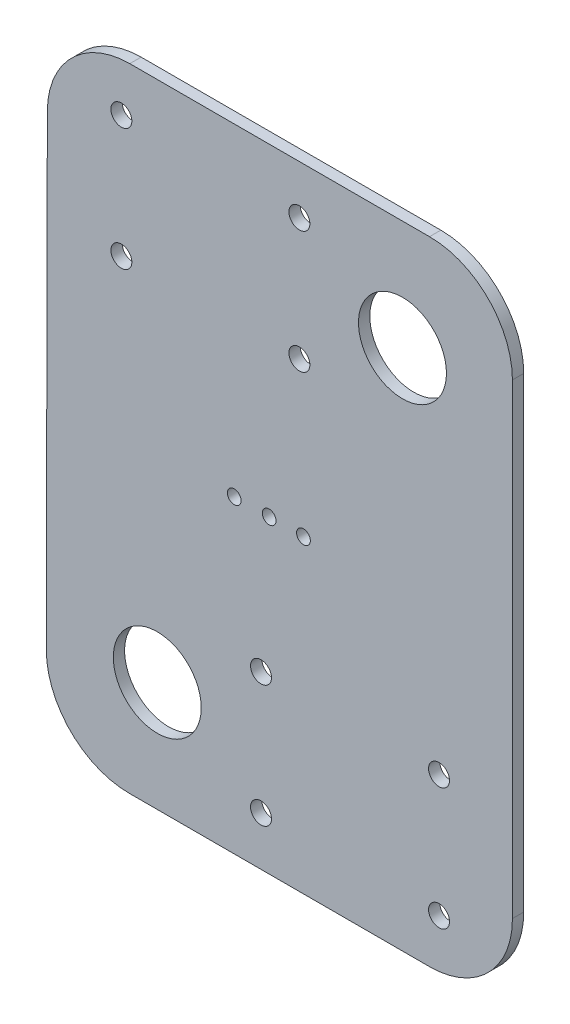
ISO-10303-21;
HEADER;
FILE_DESCRIPTION(('STEP AP214'),'2;1');
FILE_NAME('part.step','',(''),(''),'','','');
FILE_SCHEMA(('AUTOMOTIVE_DESIGN { 1 0 10303 214 1 1 1 1 }'));
ENDSEC;
DATA;
#1=APPLICATION_CONTEXT('core data for automotive mechanical design processes');
#2=APPLICATION_PROTOCOL_DEFINITION('international standard','automotive_design',2000,#1);
#3=PRODUCT_CONTEXT('',#1,'mechanical');
#4=PRODUCT('Part','Part','',(#3));
#5=PRODUCT_RELATED_PRODUCT_CATEGORY('part','',(#4));
#6=PRODUCT_DEFINITION_FORMATION('','',#4);
#7=PRODUCT_DEFINITION_CONTEXT('part definition',#1,'design');
#8=PRODUCT_DEFINITION('design','',#6,#7);
#9=PRODUCT_DEFINITION_SHAPE('','',#8);
#10=(LENGTH_UNIT() NAMED_UNIT(*) SI_UNIT(.MILLI.,.METRE.));
#11=(NAMED_UNIT(*) PLANE_ANGLE_UNIT() SI_UNIT($,.RADIAN.));
#12=(NAMED_UNIT(*) SI_UNIT($,.STERADIAN.) SOLID_ANGLE_UNIT());
#13=UNCERTAINTY_MEASURE_WITH_UNIT(LENGTH_MEASURE(1.E-05),#10,'distance_accuracy_value','');
#14=(GEOMETRIC_REPRESENTATION_CONTEXT(3) GLOBAL_UNCERTAINTY_ASSIGNED_CONTEXT((#13)) GLOBAL_UNIT_ASSIGNED_CONTEXT((#10,
#11,#12)) REPRESENTATION_CONTEXT('',''));
#15=CARTESIAN_POINT('',(0.,0.,0.));
#16=DIRECTION('',(0.,0.,1.));
#17=DIRECTION('',(1.,0.,0.));
#18=AXIS2_PLACEMENT_3D('',#15,#16,#17);
#19=CARTESIAN_POINT('',(69.322869268775,27.047872515798,-0.41148));
#20=DIRECTION('',(0.,0.,-1.));
#21=DIRECTION('',(-0.999978348347153,-0.00658048910793101,0.));
#22=AXIS2_PLACEMENT_3D('',#19,#20,#21);
#23=CYLINDRICAL_SURFACE('',#22,3.019933251512);
#24=CARTESIAN_POINT('',(69.322869268775,27.047872515798,-0.41148));
#25=DIRECTION('',(0.,0.,1.));
#26=DIRECTION('',(-0.999978348347153,-0.00658048910793101,0.));
#27=AXIS2_PLACEMENT_3D('',#24,#25,#26);
#28=CIRCLE('',#27,3.019933251512);
#29=CARTESIAN_POINT('',(66.303001403809,27.02799987793,-0.41148));
#30=VERTEX_POINT('',#29);
#31=CARTESIAN_POINT('',(69.342002868652,24.02799987793,-0.41148));
#32=VERTEX_POINT('',#31);
#33=EDGE_CURVE('E48',#30,#32,#28,.T.);
#34=ORIENTED_EDGE('',*,*,#33,.T.);
#35=DIRECTION('',(0.,0.,1.));
#36=VECTOR('',#35,1.);
#37=CARTESIAN_POINT('',(69.342002868652,24.02799987793,-0.41148));
#38=LINE('',#37,#36);
#39=CARTESIAN_POINT('',(69.342002868652,24.02799987793,0.));
#40=VERTEX_POINT('',#39);
#41=EDGE_CURVE('E221',#32,#40,#38,.T.);
#42=ORIENTED_EDGE('',*,*,#41,.T.);
#43=CARTESIAN_POINT('',(69.322869268775,27.047872515798,0.));
#44=DIRECTION('',(0.,0.,1.));
#45=DIRECTION('',(-0.999978348347153,-0.00658048910793101,0.));
#46=AXIS2_PLACEMENT_3D('',#43,#44,#45);
#47=CIRCLE('',#46,3.019933251512);
#48=CARTESIAN_POINT('',(66.303001403809,27.02799987793,0.));
#49=VERTEX_POINT('',#48);
#50=EDGE_CURVE('E262',#49,#40,#47,.T.);
#51=ORIENTED_EDGE('',*,*,#50,.F.);
#52=DIRECTION('',(0.,0.,1.));
#53=VECTOR('',#52,1.);
#54=CARTESIAN_POINT('',(66.303001403809,27.02799987793,-0.41148));
#55=LINE('',#54,#53);
#56=EDGE_CURVE('E11',#30,#49,#55,.T.);
#57=ORIENTED_EDGE('',*,*,#56,.F.);
#58=EDGE_LOOP('',(#34,#42,#51,#57));
#59=FACE_BOUND('',#58,.T.);
#60=ADVANCED_FACE('F38',(#59),#23,.T.);
#61=CARTESIAN_POINT('',(69.342002868652,24.02799987793,-0.41148));
#62=DIRECTION('',(0.,1.,0.));
#63=DIRECTION('',(1.,0.,0.));
#64=AXIS2_PLACEMENT_3D('',#61,#62,#63);
#65=PLANE('',#64);
#66=DIRECTION('',(1.,0.,0.));
#67=VECTOR('',#66,1.);
#68=CARTESIAN_POINT('',(69.342002868652,24.02799987793,-0.41148));
#69=LINE('',#68,#67);
#70=CARTESIAN_POINT('',(80.262001037598,24.02799987793,-0.41148));
#71=VERTEX_POINT('',#70);
#72=EDGE_CURVE('E218',#32,#71,#69,.T.);
#73=ORIENTED_EDGE('',*,*,#72,.T.);
#74=DIRECTION('',(0.,0.,1.));
#75=VECTOR('',#74,1.);
#76=CARTESIAN_POINT('',(80.262001037598,24.02799987793,-0.41148));
#77=LINE('',#76,#75);
#78=CARTESIAN_POINT('',(80.262001037598,24.02799987793,0.));
#79=VERTEX_POINT('',#78);
#80=EDGE_CURVE('E222',#71,#79,#77,.T.);
#81=ORIENTED_EDGE('',*,*,#80,.T.);
#82=DIRECTION('',(1.,0.,0.));
#83=VECTOR('',#82,1.);
#84=CARTESIAN_POINT('',(69.342002868652,24.02799987793,0.));
#85=LINE('',#84,#83);
#86=EDGE_CURVE('E266',#40,#79,#85,.T.);
#87=ORIENTED_EDGE('',*,*,#86,.F.);
#88=ORIENTED_EDGE('',*,*,#41,.F.);
#89=EDGE_LOOP('',(#73,#81,#87,#88));
#90=FACE_BOUND('',#89,.T.);
#91=ADVANCED_FACE('F40',(#90),#65,.F.);
#92=CARTESIAN_POINT('',(80.250663672675,27.039338483001,-0.41148));
#93=DIRECTION('',(0.,0.,-1.));
#94=DIRECTION('',(0.00376486541703731,-0.999992912869082,0.));
#95=AXIS2_PLACEMENT_3D('',#92,#93,#94);
#96=CYLINDRICAL_SURFACE('',#95,3.011359946974);
#97=CARTESIAN_POINT('',(80.250663672675,27.039338483001,-0.41148));
#98=DIRECTION('',(0.,0.,1.));
#99=DIRECTION('',(0.00376486541703731,-0.999992912869082,0.));
#100=AXIS2_PLACEMENT_3D('',#97,#98,#99);
#101=CIRCLE('',#100,3.011359946974);
#102=CARTESIAN_POINT('',(83.262001037598,27.051000595093,-0.41148));
#103=VERTEX_POINT('',#102);
#104=EDGE_CURVE('E307',#71,#103,#101,.T.);
#105=ORIENTED_EDGE('',*,*,#104,.T.);
#106=DIRECTION('',(0.,0.,1.));
#107=VECTOR('',#106,1.);
#108=CARTESIAN_POINT('',(83.262001037598,27.051000595093,-0.41148));
#109=LINE('',#108,#107);
#110=CARTESIAN_POINT('',(83.262001037598,27.051000595093,0.));
#111=VERTEX_POINT('',#110);
#112=EDGE_CURVE('E318',#103,#111,#109,.T.);
#113=ORIENTED_EDGE('',*,*,#112,.T.);
#114=CARTESIAN_POINT('',(80.250663672675,27.039338483001,0.));
#115=DIRECTION('',(0.,0.,1.));
#116=DIRECTION('',(0.00376486541703731,-0.999992912869082,0.));
#117=AXIS2_PLACEMENT_3D('',#114,#115,#116);
#118=CIRCLE('',#117,3.011359946974);
#119=EDGE_CURVE('E322',#79,#111,#118,.T.);
#120=ORIENTED_EDGE('',*,*,#119,.F.);
#121=ORIENTED_EDGE('',*,*,#80,.F.);
#122=EDGE_LOOP('',(#105,#113,#120,#121));
#123=FACE_BOUND('',#122,.T.);
#124=ADVANCED_FACE('F382',(#123),#96,.T.);
#125=CARTESIAN_POINT('',(83.262001037598,27.051000595093,-0.41148));
#126=DIRECTION('',(-1.,0.,0.));
#127=DIRECTION('',(0.,0.,1.));
#128=AXIS2_PLACEMENT_3D('',#125,#126,#127);
#129=PLANE('',#128);
#130=DIRECTION('',(0.,1.,0.));
#131=VECTOR('',#130,1.);
#132=CARTESIAN_POINT('',(83.262001037598,27.051000595093,-0.41148));
#133=LINE('',#132,#131);
#134=CARTESIAN_POINT('',(83.262001037598,44.021999359131,-0.41148));
#135=VERTEX_POINT('',#134);
#136=EDGE_CURVE('E234',#103,#135,#133,.T.);
#137=ORIENTED_EDGE('',*,*,#136,.T.);
#138=DIRECTION('',(0.,0.,1.));
#139=VECTOR('',#138,1.);
#140=CARTESIAN_POINT('',(83.262001037598,44.021999359131,-0.41148));
#141=LINE('',#140,#139);
#142=CARTESIAN_POINT('',(83.262001037598,44.021999359131,0.));
#143=VERTEX_POINT('',#142);
#144=EDGE_CURVE('E231',#135,#143,#141,.T.);
#145=ORIENTED_EDGE('',*,*,#144,.T.);
#146=DIRECTION('',(0.,1.,0.));
#147=VECTOR('',#146,1.);
#148=CARTESIAN_POINT('',(83.262001037598,27.051000595093,0.));
#149=LINE('',#148,#147);
#150=EDGE_CURVE('E173',#111,#143,#149,.T.);
#151=ORIENTED_EDGE('',*,*,#150,.F.);
#152=ORIENTED_EDGE('',*,*,#112,.F.);
#153=EDGE_LOOP('',(#137,#145,#151,#152));
#154=FACE_BOUND('',#153,.T.);
#155=ADVANCED_FACE('F390',(#154),#129,.F.);
#156=CARTESIAN_POINT('',(80.250668110381,44.016665842291,-0.41148));
#157=DIRECTION('',(0.,0.,-1.));
#158=DIRECTION('',(0.999998431520749,0.00177114540403055,0.));
#159=AXIS2_PLACEMENT_3D('',#156,#157,#158);
#160=CYLINDRICAL_SURFACE('',#159,3.011337650437);
#161=CARTESIAN_POINT('',(80.250668110381,44.016665842291,-0.41148));
#162=DIRECTION('',(0.,0.,1.));
#163=DIRECTION('',(0.999998431520749,0.00177114540403055,0.));
#164=AXIS2_PLACEMENT_3D('',#161,#162,#163);
#165=CIRCLE('',#164,3.011337650437);
#166=CARTESIAN_POINT('',(80.246002197266,47.02799987793,-0.41148));
#167=VERTEX_POINT('',#166);
#168=EDGE_CURVE('E235',#135,#167,#165,.T.);
#169=ORIENTED_EDGE('',*,*,#168,.T.);
#170=DIRECTION('',(0.,0.,1.));
#171=VECTOR('',#170,1.);
#172=CARTESIAN_POINT('',(80.246002197266,47.02799987793,-0.41148));
#173=LINE('',#172,#171);
#174=CARTESIAN_POINT('',(80.246002197266,47.02799987793,0.));
#175=VERTEX_POINT('',#174);
#176=EDGE_CURVE('E241',#167,#175,#173,.T.);
#177=ORIENTED_EDGE('',*,*,#176,.T.);
#178=CARTESIAN_POINT('',(80.250668110381,44.016665842291,0.));
#179=DIRECTION('',(0.,0.,1.));
#180=DIRECTION('',(0.999998431520749,0.00177114540403055,0.));
#181=AXIS2_PLACEMENT_3D('',#178,#179,#180);
#182=CIRCLE('',#181,3.011337650437);
#183=EDGE_CURVE('E170',#143,#175,#182,.T.);
#184=ORIENTED_EDGE('',*,*,#183,.F.);
#185=ORIENTED_EDGE('',*,*,#144,.F.);
#186=EDGE_LOOP('',(#169,#177,#184,#185));
#187=FACE_BOUND('',#186,.T.);
#188=ADVANCED_FACE('F405',(#187),#160,.T.);
#189=CARTESIAN_POINT('',(80.246002197266,47.02799987793,-0.41148));
#190=DIRECTION('',(0.,-1.,0.));
#191=DIRECTION('',(0.,0.,-1.));
#192=AXIS2_PLACEMENT_3D('',#189,#190,#191);
#193=PLANE('',#192);
#194=DIRECTION('',(-1.,0.,0.));
#195=VECTOR('',#194,1.);
#196=CARTESIAN_POINT('',(80.246002197266,47.02799987793,-0.41148));
#197=LINE('',#196,#195);
#198=CARTESIAN_POINT('',(69.342002868652,47.02799987793,-0.41148));
#199=VERTEX_POINT('',#198);
#200=EDGE_CURVE('E209',#167,#199,#197,.T.);
#201=ORIENTED_EDGE('',*,*,#200,.T.);
#202=DIRECTION('',(0.,0.,1.));
#203=VECTOR('',#202,1.);
#204=CARTESIAN_POINT('',(69.342002868652,47.02799987793,-0.41148));
#205=LINE('',#204,#203);
#206=CARTESIAN_POINT('',(69.342002868652,47.02799987793,0.));
#207=VERTEX_POINT('',#206);
#208=EDGE_CURVE('E207',#199,#207,#205,.T.);
#209=ORIENTED_EDGE('',*,*,#208,.T.);
#210=DIRECTION('',(-1.,0.,0.));
#211=VECTOR('',#210,1.);
#212=CARTESIAN_POINT('',(80.246002197266,47.02799987793,0.));
#213=LINE('',#212,#211);
#214=EDGE_CURVE('E167',#175,#207,#213,.T.);
#215=ORIENTED_EDGE('',*,*,#214,.F.);
#216=ORIENTED_EDGE('',*,*,#176,.F.);
#217=EDGE_LOOP('',(#201,#209,#215,#216));
#218=FACE_BOUND('',#217,.T.);
#219=ADVANCED_FACE('F409',(#218),#193,.F.);
#220=CARTESIAN_POINT('',(69.351632143134,44.01836062726,-0.41148));
#221=DIRECTION('',(0.,0.,-1.));
#222=DIRECTION('',(-0.0031994615945799,0.999994881709654,0.));
#223=AXIS2_PLACEMENT_3D('',#220,#221,#222);
#224=CYLINDRICAL_SURFACE('',#223,3.009654654956);
#225=DIRECTION('',(0.,0.,-1.));
#226=VECTOR('',#225,1.);
#227=CARTESIAN_POINT('',(66.342002868652,44.0307207356427,-0.41148));
#228=LINE('',#227,#226);
#229=CARTESIAN_POINT('',(66.342002868652,44.0307207356427,0.));
#230=VERTEX_POINT('',#229);
#231=CARTESIAN_POINT('',(66.342002868652,44.0307207356427,-0.41148));
#232=VERTEX_POINT('',#231);
#233=EDGE_CURVE('E148',#230,#232,#228,.T.);
#234=ORIENTED_EDGE('',*,*,#233,.F.);
#235=CARTESIAN_POINT('',(69.351632143134,44.01836062726,0.));
#236=DIRECTION('',(0.,0.,1.));
#237=DIRECTION('',(-0.0031994615945799,0.999994881709654,0.));
#238=AXIS2_PLACEMENT_3D('',#235,#236,#237);
#239=CIRCLE('',#238,3.009654654956);
#240=EDGE_CURVE('E154',#207,#230,#239,.T.);
#241=ORIENTED_EDGE('',*,*,#240,.F.);
#242=ORIENTED_EDGE('',*,*,#208,.F.);
#243=CARTESIAN_POINT('',(69.351632143134,44.01836062726,-0.41148));
#244=DIRECTION('',(0.,0.,1.));
#245=DIRECTION('',(-0.0031994615945799,0.999994881709654,0.));
#246=AXIS2_PLACEMENT_3D('',#243,#244,#245);
#247=CIRCLE('',#246,3.009654654956);
#248=EDGE_CURVE('E161',#199,#232,#247,.T.);
#249=ORIENTED_EDGE('',*,*,#248,.T.);
#250=EDGE_LOOP('',(#234,#241,#242,#249));
#251=FACE_BOUND('',#250,.T.);
#252=ADVANCED_FACE('F158',(#251),#224,.T.);
#253=CARTESIAN_POINT('',(74.11565314,25.80836342,-0.41148));
#254=DIRECTION('',(0.,0.,-1.));
#255=DIRECTION('',(1.,0.,0.));
#256=AXIS2_PLACEMENT_3D('',#253,#254,#255);
#257=CYLINDRICAL_SURFACE('',#256,0.381);
#258=DIRECTION('',(0.,0.,1.));
#259=VECTOR('',#258,1.);
#260=CARTESIAN_POINT('',(74.49665314,25.80836342,-0.41148));
#261=LINE('',#260,#259);
#262=CARTESIAN_POINT('',(74.49665314,25.80836342,-0.41148));
#263=VERTEX_POINT('',#262);
#264=CARTESIAN_POINT('',(74.49665314,25.80836342,0.));
#265=VERTEX_POINT('',#264);
#266=EDGE_CURVE('E192',#263,#265,#261,.T.);
#267=ORIENTED_EDGE('',*,*,#266,.T.);
#268=CARTESIAN_POINT('',(74.11565314,25.80836342,0.));
#269=DIRECTION('',(0.,0.,1.));
#270=DIRECTION('',(1.,0.,0.));
#271=AXIS2_PLACEMENT_3D('',#268,#269,#270);
#272=CIRCLE('',#271,0.381);
#273=EDGE_CURVE('E195',#265,#265,#272,.T.);
#274=ORIENTED_EDGE('',*,*,#273,.T.);
#275=ORIENTED_EDGE('',*,*,#266,.F.);
#276=CARTESIAN_POINT('',(74.11565314,25.80836342,-0.41148));
#277=DIRECTION('',(0.,0.,1.));
#278=DIRECTION('',(1.,0.,0.));
#279=AXIS2_PLACEMENT_3D('',#276,#277,#278);
#280=CIRCLE('',#279,0.381);
#281=EDGE_CURVE('E214',#263,#263,#280,.T.);
#282=ORIENTED_EDGE('',*,*,#281,.F.);
#283=EDGE_LOOP('',(#267,#274,#275,#282));
#284=FACE_BOUND('',#283,.T.);
#285=ADVANCED_FACE('F392',(#284),#257,.F.);
#286=CARTESIAN_POINT('',(70.3416551,28.02836406,-0.41148));
#287=DIRECTION('',(0.,0.,-1.));
#288=DIRECTION('',(1.,0.,0.));
#289=AXIS2_PLACEMENT_3D('',#286,#287,#288);
#290=CYLINDRICAL_SURFACE('',#289,1.59999934);
#291=DIRECTION('',(0.,0.,1.));
#292=VECTOR('',#291,1.);
#293=CARTESIAN_POINT('',(71.94165444,28.02836406,-0.41148));
#294=LINE('',#293,#292);
#295=CARTESIAN_POINT('',(71.94165444,28.02836406,-0.41148));
#296=VERTEX_POINT('',#295);
#297=CARTESIAN_POINT('',(71.94165444,28.02836406,0.));
#298=VERTEX_POINT('',#297);
#299=EDGE_CURVE('E244',#296,#298,#294,.T.);
#300=ORIENTED_EDGE('',*,*,#299,.T.);
#301=CARTESIAN_POINT('',(70.3416551,28.02836406,0.));
#302=DIRECTION('',(0.,0.,1.));
#303=DIRECTION('',(1.,0.,0.));
#304=AXIS2_PLACEMENT_3D('',#301,#302,#303);
#305=CIRCLE('',#304,1.59999934);
#306=EDGE_CURVE('E259',#298,#298,#305,.T.);
#307=ORIENTED_EDGE('',*,*,#306,.T.);
#308=ORIENTED_EDGE('',*,*,#299,.F.);
#309=CARTESIAN_POINT('',(70.3416551,28.02836406,-0.41148));
#310=DIRECTION('',(0.,0.,1.));
#311=DIRECTION('',(1.,0.,0.));
#312=AXIS2_PLACEMENT_3D('',#309,#310,#311);
#313=CIRCLE('',#312,1.59999934);
#314=EDGE_CURVE('E215',#296,#296,#313,.T.);
#315=ORIENTED_EDGE('',*,*,#314,.F.);
#316=EDGE_LOOP('',(#300,#307,#308,#315));
#317=FACE_BOUND('',#316,.T.);
#318=ADVANCED_FACE('F395',(#317),#290,.F.);
#319=CARTESIAN_POINT('',(80.59265314,25.80836342,-0.41148));
#320=DIRECTION('',(0.,0.,-1.));
#321=DIRECTION('',(1.,0.,0.));
#322=AXIS2_PLACEMENT_3D('',#319,#320,#321);
#323=CYLINDRICAL_SURFACE('',#322,0.381);
#324=DIRECTION('',(0.,0.,1.));
#325=VECTOR('',#324,1.);
#326=CARTESIAN_POINT('',(80.97365314,25.80836342,-0.41148));
#327=LINE('',#326,#325);
#328=CARTESIAN_POINT('',(80.97365314,25.80836342,-0.41148));
#329=VERTEX_POINT('',#328);
#330=CARTESIAN_POINT('',(80.97365314,25.80836342,0.));
#331=VERTEX_POINT('',#330);
#332=EDGE_CURVE('E278',#329,#331,#327,.T.);
#333=ORIENTED_EDGE('',*,*,#332,.T.);
#334=CARTESIAN_POINT('',(80.59265314,25.80836342,0.));
#335=DIRECTION('',(0.,0.,1.));
#336=DIRECTION('',(1.,0.,0.));
#337=AXIS2_PLACEMENT_3D('',#334,#335,#336);
#338=CIRCLE('',#337,0.381);
#339=EDGE_CURVE('E281',#331,#331,#338,.T.);
#340=ORIENTED_EDGE('',*,*,#339,.T.);
#341=ORIENTED_EDGE('',*,*,#332,.F.);
#342=CARTESIAN_POINT('',(80.59265314,25.80836342,-0.41148));
#343=DIRECTION('',(0.,0.,1.));
#344=DIRECTION('',(1.,0.,0.));
#345=AXIS2_PLACEMENT_3D('',#342,#343,#344);
#346=CIRCLE('',#345,0.381);
#347=EDGE_CURVE('E185',#329,#329,#346,.T.);
#348=ORIENTED_EDGE('',*,*,#347,.F.);
#349=EDGE_LOOP('',(#333,#340,#341,#348));
#350=FACE_BOUND('',#349,.T.);
#351=ADVANCED_FACE('F497',(#350),#323,.F.);
#352=CARTESIAN_POINT('',(73.14025504,35.28136454,-0.41148));
#353=DIRECTION('',(0.,0.,-1.));
#354=DIRECTION('',(1.,0.,0.));
#355=AXIS2_PLACEMENT_3D('',#352,#353,#354);
#356=CYLINDRICAL_SURFACE('',#355,0.2499995);
#357=DIRECTION('',(0.,0.,1.));
#358=VECTOR('',#357,1.);
#359=CARTESIAN_POINT('',(73.39025454,35.28136454,-0.41148));
#360=LINE('',#359,#358);
#361=CARTESIAN_POINT('',(73.39025454,35.28136454,-0.41148));
#362=VERTEX_POINT('',#361);
#363=CARTESIAN_POINT('',(73.39025454,35.28136454,0.));
#364=VERTEX_POINT('',#363);
#365=EDGE_CURVE('E285',#362,#364,#360,.T.);
#366=ORIENTED_EDGE('',*,*,#365,.T.);
#367=CARTESIAN_POINT('',(73.14025504,35.28136454,0.));
#368=DIRECTION('',(0.,0.,1.));
#369=DIRECTION('',(1.,0.,0.));
#370=AXIS2_PLACEMENT_3D('',#367,#368,#369);
#371=CIRCLE('',#370,0.2499995);
#372=EDGE_CURVE('E288',#364,#364,#371,.T.);
#373=ORIENTED_EDGE('',*,*,#372,.T.);
#374=ORIENTED_EDGE('',*,*,#365,.F.);
#375=CARTESIAN_POINT('',(73.14025504,35.28136454,-0.41148));
#376=DIRECTION('',(0.,0.,1.));
#377=DIRECTION('',(1.,0.,0.));
#378=AXIS2_PLACEMENT_3D('',#375,#376,#377);
#379=CIRCLE('',#378,0.2499995);
#380=EDGE_CURVE('E182',#362,#362,#379,.T.);
#381=ORIENTED_EDGE('',*,*,#380,.F.);
#382=EDGE_LOOP('',(#366,#373,#374,#381));
#383=FACE_BOUND('',#382,.T.);
#384=ADVANCED_FACE('F489',(#383),#356,.F.);
#385=CARTESIAN_POINT('',(80.59265314,30.25336342,-0.41148));
#386=DIRECTION('',(0.,0.,-1.));
#387=DIRECTION('',(1.,0.,0.));
#388=AXIS2_PLACEMENT_3D('',#385,#386,#387);
#389=CYLINDRICAL_SURFACE('',#388,0.381);
#390=DIRECTION('',(0.,0.,1.));
#391=VECTOR('',#390,1.);
#392=CARTESIAN_POINT('',(80.97365314,30.25336342,-0.41148));
#393=LINE('',#392,#391);
#394=CARTESIAN_POINT('',(80.97365314,30.25336342,-0.41148));
#395=VERTEX_POINT('',#394);
#396=CARTESIAN_POINT('',(80.97365314,30.25336342,0.));
#397=VERTEX_POINT('',#396);
#398=EDGE_CURVE('E293',#395,#397,#393,.T.);
#399=ORIENTED_EDGE('',*,*,#398,.T.);
#400=CARTESIAN_POINT('',(80.59265314,30.25336342,0.));
#401=DIRECTION('',(0.,0.,1.));
#402=DIRECTION('',(1.,0.,0.));
#403=AXIS2_PLACEMENT_3D('',#400,#401,#402);
#404=CIRCLE('',#403,0.381);
#405=EDGE_CURVE('E303',#397,#397,#404,.T.);
#406=ORIENTED_EDGE('',*,*,#405,.T.);
#407=ORIENTED_EDGE('',*,*,#398,.F.);
#408=CARTESIAN_POINT('',(80.59265314,30.25336342,-0.41148));
#409=DIRECTION('',(0.,0.,1.));
#410=DIRECTION('',(1.,0.,0.));
#411=AXIS2_PLACEMENT_3D('',#408,#409,#410);
#412=CIRCLE('',#411,0.381);
#413=EDGE_CURVE('E186',#395,#395,#412,.T.);
#414=ORIENTED_EDGE('',*,*,#413,.F.);
#415=EDGE_LOOP('',(#399,#406,#407,#414));
#416=FACE_BOUND('',#415,.T.);
#417=ADVANCED_FACE('F342',(#416),#389,.F.);
#418=CARTESIAN_POINT('',(74.11565314,30.25336342,-0.41148));
#419=DIRECTION('',(0.,0.,-1.));
#420=DIRECTION('',(1.,0.,0.));
#421=AXIS2_PLACEMENT_3D('',#418,#419,#420);
#422=CYLINDRICAL_SURFACE('',#421,0.381);
#423=DIRECTION('',(0.,0.,1.));
#424=VECTOR('',#423,1.);
#425=CARTESIAN_POINT('',(74.49665314,30.25336342,-0.41148));
#426=LINE('',#425,#424);
#427=CARTESIAN_POINT('',(74.49665314,30.25336342,-0.41148));
#428=VERTEX_POINT('',#427);
#429=CARTESIAN_POINT('',(74.49665314,30.25336342,0.));
#430=VERTEX_POINT('',#429);
#431=EDGE_CURVE('E272',#428,#430,#426,.T.);
#432=ORIENTED_EDGE('',*,*,#431,.T.);
#433=CARTESIAN_POINT('',(74.11565314,30.25336342,0.));
#434=DIRECTION('',(0.,0.,1.));
#435=DIRECTION('',(1.,0.,0.));
#436=AXIS2_PLACEMENT_3D('',#433,#434,#435);
#437=CIRCLE('',#436,0.381);
#438=EDGE_CURVE('E205',#430,#430,#437,.T.);
#439=ORIENTED_EDGE('',*,*,#438,.T.);
#440=ORIENTED_EDGE('',*,*,#431,.F.);
#441=CARTESIAN_POINT('',(74.11565314,30.25336342,-0.41148));
#442=DIRECTION('',(0.,0.,1.));
#443=DIRECTION('',(1.,0.,0.));
#444=AXIS2_PLACEMENT_3D('',#441,#442,#443);
#445=CIRCLE('',#444,0.381);
#446=EDGE_CURVE('E230',#428,#428,#445,.T.);
#447=ORIENTED_EDGE('',*,*,#446,.F.);
#448=EDGE_LOOP('',(#432,#439,#440,#447));
#449=FACE_BOUND('',#448,.T.);
#450=ADVANCED_FACE('F475',(#449),#422,.F.);
#451=CARTESIAN_POINT('',(69.03525436,40.80856456,-0.41148));
#452=DIRECTION('',(0.,0.,-1.));
#453=DIRECTION('',(1.,0.,0.));
#454=AXIS2_PLACEMENT_3D('',#451,#452,#453);
#455=CYLINDRICAL_SURFACE('',#454,0.381);
#456=DIRECTION('',(0.,0.,1.));
#457=VECTOR('',#456,1.);
#458=CARTESIAN_POINT('',(69.41625436,40.80856456,-0.41148));
#459=LINE('',#458,#457);
#460=CARTESIAN_POINT('',(69.41625436,40.80856456,-0.41148));
#461=VERTEX_POINT('',#460);
#462=CARTESIAN_POINT('',(69.41625436,40.80856456,0.));
#463=VERTEX_POINT('',#462);
#464=EDGE_CURVE('E202',#461,#463,#459,.T.);
#465=ORIENTED_EDGE('',*,*,#464,.T.);
#466=CARTESIAN_POINT('',(69.03525436,40.80856456,0.));
#467=DIRECTION('',(0.,0.,1.));
#468=DIRECTION('',(1.,0.,0.));
#469=AXIS2_PLACEMENT_3D('',#466,#467,#468);
#470=CIRCLE('',#469,0.381);
#471=EDGE_CURVE('E206',#463,#463,#470,.T.);
#472=ORIENTED_EDGE('',*,*,#471,.T.);
#473=ORIENTED_EDGE('',*,*,#464,.F.);
#474=CARTESIAN_POINT('',(69.03525436,40.80856456,-0.41148));
#475=DIRECTION('',(0.,0.,1.));
#476=DIRECTION('',(1.,0.,0.));
#477=AXIS2_PLACEMENT_3D('',#474,#475,#476);
#478=CIRCLE('',#477,0.381);
#479=EDGE_CURVE('E267',#461,#461,#478,.T.);
#480=ORIENTED_EDGE('',*,*,#479,.F.);
#481=EDGE_LOOP('',(#465,#472,#473,#480));
#482=FACE_BOUND('',#481,.T.);
#483=ADVANCED_FACE('F401',(#482),#455,.F.);
#484=CARTESIAN_POINT('',(74.41025504,35.28136454,-0.41148));
#485=DIRECTION('',(0.,0.,-1.));
#486=DIRECTION('',(1.,0.,0.));
#487=AXIS2_PLACEMENT_3D('',#484,#485,#486);
#488=CYLINDRICAL_SURFACE('',#487,0.2499995);
#489=DIRECTION('',(0.,0.,1.));
#490=VECTOR('',#489,1.);
#491=CARTESIAN_POINT('',(74.66025454,35.28136454,-0.41148));
#492=LINE('',#491,#490);
#493=CARTESIAN_POINT('',(74.66025454,35.28136454,-0.41148));
#494=VERTEX_POINT('',#493);
#495=CARTESIAN_POINT('',(74.66025454,35.28136454,0.));
#496=VERTEX_POINT('',#495);
#497=EDGE_CURVE('E254',#494,#496,#492,.T.);
#498=ORIENTED_EDGE('',*,*,#497,.T.);
#499=CARTESIAN_POINT('',(74.41025504,35.28136454,0.));
#500=DIRECTION('',(0.,0.,1.));
#501=DIRECTION('',(1.,0.,0.));
#502=AXIS2_PLACEMENT_3D('',#499,#500,#501);
#503=CIRCLE('',#502,0.2499995);
#504=EDGE_CURVE('E189',#496,#496,#503,.T.);
#505=ORIENTED_EDGE('',*,*,#504,.T.);
#506=ORIENTED_EDGE('',*,*,#497,.F.);
#507=CARTESIAN_POINT('',(74.41025504,35.28136454,-0.41148));
#508=DIRECTION('',(0.,0.,1.));
#509=DIRECTION('',(1.,0.,0.));
#510=AXIS2_PLACEMENT_3D('',#507,#508,#509);
#511=CIRCLE('',#510,0.2499995);
#512=EDGE_CURVE('E226',#494,#494,#511,.T.);
#513=ORIENTED_EDGE('',*,*,#512,.F.);
#514=EDGE_LOOP('',(#498,#505,#506,#513));
#515=FACE_BOUND('',#514,.T.);
#516=ADVANCED_FACE('F397',(#515),#488,.F.);
#517=CARTESIAN_POINT('',(75.66025508,35.28136454,-0.41148));
#518=DIRECTION('',(0.,0.,-1.));
#519=DIRECTION('',(1.,0.,0.));
#520=AXIS2_PLACEMENT_3D('',#517,#518,#519);
#521=CYLINDRICAL_SURFACE('',#520,0.2499995);
#522=DIRECTION('',(0.,0.,1.));
#523=VECTOR('',#522,1.);
#524=CARTESIAN_POINT('',(75.91025458,35.28136454,-0.41148));
#525=LINE('',#524,#523);
#526=CARTESIAN_POINT('',(75.91025458,35.28136454,-0.41148));
#527=VERTEX_POINT('',#526);
#528=CARTESIAN_POINT('',(75.91025458,35.28136454,0.));
#529=VERTEX_POINT('',#528);
#530=EDGE_CURVE('E187',#527,#529,#525,.T.);
#531=ORIENTED_EDGE('',*,*,#530,.T.);
#532=CARTESIAN_POINT('',(75.66025508,35.28136454,0.));
#533=DIRECTION('',(0.,0.,1.));
#534=DIRECTION('',(1.,0.,0.));
#535=AXIS2_PLACEMENT_3D('',#532,#533,#534);
#536=CIRCLE('',#535,0.2499995);
#537=EDGE_CURVE('E190',#529,#529,#536,.T.);
#538=ORIENTED_EDGE('',*,*,#537,.T.);
#539=ORIENTED_EDGE('',*,*,#530,.F.);
#540=CARTESIAN_POINT('',(75.66025508,35.28136454,-0.41148));
#541=DIRECTION('',(0.,0.,1.));
#542=DIRECTION('',(1.,0.,0.));
#543=AXIS2_PLACEMENT_3D('',#540,#541,#542);
#544=CIRCLE('',#543,0.2499995);
#545=EDGE_CURVE('E223',#527,#527,#544,.T.);
#546=ORIENTED_EDGE('',*,*,#545,.F.);
#547=EDGE_LOOP('',(#531,#538,#539,#546));
#548=FACE_BOUND('',#547,.T.);
#549=ADVANCED_FACE('F400',(#548),#521,.F.);
#550=CARTESIAN_POINT('',(75.51225436,40.80856456,-0.41148));
#551=DIRECTION('',(0.,0.,-1.));
#552=DIRECTION('',(1.,0.,0.));
#553=AXIS2_PLACEMENT_3D('',#550,#551,#552);
#554=CYLINDRICAL_SURFACE('',#553,0.381);
#555=DIRECTION('',(0.,0.,1.));
#556=VECTOR('',#555,1.);
#557=CARTESIAN_POINT('',(75.89325436,40.80856456,-0.41148));
#558=LINE('',#557,#556);
#559=CARTESIAN_POINT('',(75.89325436,40.80856456,-0.41148));
#560=VERTEX_POINT('',#559);
#561=CARTESIAN_POINT('',(75.89325436,40.80856456,0.));
#562=VERTEX_POINT('',#561);
#563=EDGE_CURVE('E238',#560,#562,#558,.T.);
#564=ORIENTED_EDGE('',*,*,#563,.T.);
#565=CARTESIAN_POINT('',(75.51225436,40.80856456,0.));
#566=DIRECTION('',(0.,0.,1.));
#567=DIRECTION('',(1.,0.,0.));
#568=AXIS2_PLACEMENT_3D('',#565,#566,#567);
#569=CIRCLE('',#568,0.381);
#570=EDGE_CURVE('E298',#562,#562,#569,.T.);
#571=ORIENTED_EDGE('',*,*,#570,.T.);
#572=ORIENTED_EDGE('',*,*,#563,.F.);
#573=CARTESIAN_POINT('',(75.51225436,40.80856456,-0.41148));
#574=DIRECTION('',(0.,0.,1.));
#575=DIRECTION('',(1.,0.,0.));
#576=AXIS2_PLACEMENT_3D('',#573,#574,#575);
#577=CIRCLE('',#576,0.381);
#578=EDGE_CURVE('E227',#560,#560,#577,.T.);
#579=ORIENTED_EDGE('',*,*,#578,.F.);
#580=EDGE_LOOP('',(#564,#571,#572,#579));
#581=FACE_BOUND('',#580,.T.);
#582=ADVANCED_FACE('F385',(#581),#554,.F.);
#583=CARTESIAN_POINT('',(79.26165504,43.02836454,-0.41148));
#584=DIRECTION('',(0.,0.,-1.));
#585=DIRECTION('',(1.,0.,0.));
#586=AXIS2_PLACEMENT_3D('',#583,#584,#585);
#587=CYLINDRICAL_SURFACE('',#586,1.59999934);
#588=DIRECTION('',(0.,0.,1.));
#589=VECTOR('',#588,1.);
#590=CARTESIAN_POINT('',(80.86165438,43.02836454,-0.41148));
#591=LINE('',#590,#589);
#592=CARTESIAN_POINT('',(80.86165438,43.02836454,-0.41148));
#593=VERTEX_POINT('',#592);
#594=CARTESIAN_POINT('',(80.86165438,43.02836454,0.));
#595=VERTEX_POINT('',#594);
#596=EDGE_CURVE('E199',#593,#595,#591,.T.);
#597=ORIENTED_EDGE('',*,*,#596,.T.);
#598=CARTESIAN_POINT('',(79.26165504,43.02836454,0.));
#599=DIRECTION('',(0.,0.,1.));
#600=DIRECTION('',(1.,0.,0.));
#601=AXIS2_PLACEMENT_3D('',#598,#599,#600);
#602=CIRCLE('',#601,1.59999934);
#603=EDGE_CURVE('E196',#595,#595,#602,.T.);
#604=ORIENTED_EDGE('',*,*,#603,.T.);
#605=ORIENTED_EDGE('',*,*,#596,.F.);
#606=CARTESIAN_POINT('',(79.26165504,43.02836454,-0.41148));
#607=DIRECTION('',(0.,0.,1.));
#608=DIRECTION('',(1.,0.,0.));
#609=AXIS2_PLACEMENT_3D('',#606,#607,#608);
#610=CIRCLE('',#609,1.59999934);
#611=EDGE_CURVE('E275',#593,#593,#610,.T.);
#612=ORIENTED_EDGE('',*,*,#611,.F.);
#613=EDGE_LOOP('',(#597,#604,#605,#612));
#614=FACE_BOUND('',#613,.T.);
#615=ADVANCED_FACE('F415',(#614),#587,.F.);
#616=CARTESIAN_POINT('',(69.03525436,45.25356456,-0.41148));
#617=DIRECTION('',(0.,0.,-1.));
#618=DIRECTION('',(1.,0.,0.));
#619=AXIS2_PLACEMENT_3D('',#616,#617,#618);
#620=CYLINDRICAL_SURFACE('',#619,0.381);
#621=DIRECTION('',(0.,0.,1.));
#622=VECTOR('',#621,1.);
#623=CARTESIAN_POINT('',(69.41625436,45.25356456,-0.41148));
#624=LINE('',#623,#622);
#625=CARTESIAN_POINT('',(69.41625436,45.25356456,-0.41148));
#626=VERTEX_POINT('',#625);
#627=CARTESIAN_POINT('',(69.41625436,45.25356456,0.));
#628=VERTEX_POINT('',#627);
#629=EDGE_CURVE('E200',#626,#628,#624,.T.);
#630=ORIENTED_EDGE('',*,*,#629,.T.);
#631=CARTESIAN_POINT('',(69.03525436,45.25356456,0.));
#632=DIRECTION('',(0.,0.,1.));
#633=DIRECTION('',(1.,0.,0.));
#634=AXIS2_PLACEMENT_3D('',#631,#632,#633);
#635=CIRCLE('',#634,0.381);
#636=EDGE_CURVE('E245',#628,#628,#635,.T.);
#637=ORIENTED_EDGE('',*,*,#636,.T.);
#638=ORIENTED_EDGE('',*,*,#629,.F.);
#639=CARTESIAN_POINT('',(69.03525436,45.25356456,-0.41148));
#640=DIRECTION('',(0.,0.,1.));
#641=DIRECTION('',(1.,0.,0.));
#642=AXIS2_PLACEMENT_3D('',#639,#640,#641);
#643=CIRCLE('',#642,0.381);
#644=EDGE_CURVE('E284',#626,#626,#643,.T.);
#645=ORIENTED_EDGE('',*,*,#644,.F.);
#646=EDGE_LOOP('',(#630,#637,#638,#645));
#647=FACE_BOUND('',#646,.T.);
#648=ADVANCED_FACE('F372',(#647),#620,.F.);
#649=CARTESIAN_POINT('',(75.51225436,45.25356456,-0.41148));
#650=DIRECTION('',(0.,0.,-1.));
#651=DIRECTION('',(1.,0.,0.));
#652=AXIS2_PLACEMENT_3D('',#649,#650,#651);
#653=CYLINDRICAL_SURFACE('',#652,0.381);
#654=DIRECTION('',(0.,0.,1.));
#655=VECTOR('',#654,1.);
#656=CARTESIAN_POINT('',(75.89325436,45.25356456,-0.41148));
#657=LINE('',#656,#655);
#658=CARTESIAN_POINT('',(75.89325436,45.25356456,-0.41148));
#659=VERTEX_POINT('',#658);
#660=CARTESIAN_POINT('',(75.89325436,45.25356456,0.));
#661=VERTEX_POINT('',#660);
#662=EDGE_CURVE('E213',#659,#661,#657,.T.);
#663=ORIENTED_EDGE('',*,*,#662,.T.);
#664=CARTESIAN_POINT('',(75.51225436,45.25356456,0.));
#665=DIRECTION('',(0.,0.,1.));
#666=DIRECTION('',(1.,0.,0.));
#667=AXIS2_PLACEMENT_3D('',#664,#665,#666);
#668=CIRCLE('',#667,0.381);
#669=EDGE_CURVE('E210',#661,#661,#668,.T.);
#670=ORIENTED_EDGE('',*,*,#669,.T.);
#671=ORIENTED_EDGE('',*,*,#662,.F.);
#672=CARTESIAN_POINT('',(75.51225436,45.25356456,-0.41148));
#673=DIRECTION('',(0.,0.,1.));
#674=DIRECTION('',(1.,0.,0.));
#675=AXIS2_PLACEMENT_3D('',#672,#673,#674);
#676=CIRCLE('',#675,0.381);
#677=EDGE_CURVE('E265',#659,#659,#676,.T.);
#678=ORIENTED_EDGE('',*,*,#677,.F.);
#679=EDGE_LOOP('',(#663,#670,#671,#678));
#680=FACE_BOUND('',#679,.T.);
#681=ADVANCED_FACE('F364',(#680),#653,.F.);
#682=CARTESIAN_POINT('',(4.842000007629,3.006000041962,-0.41148));
#683=DIRECTION('',(0.,0.,-1.));
#684=DIRECTION('',(0.,-1.,0.));
#685=AXIS2_PLACEMENT_3D('',#682,#683,#684);
#686=PLANE('',#685);
#687=DIRECTION('',(0.,1.,0.));
#688=VECTOR('',#687,1.);
#689=CARTESIAN_POINT('',(66.342002868652,61.992348673297,-0.41148));
#690=LINE('',#689,#688);
#691=CARTESIAN_POINT('',(66.3420028686545,44.0060005210288,-0.41148));
#692=VERTEX_POINT('',#691);
#693=EDGE_CURVE('E162',#232,#692,#690,.F.);
#694=ORIENTED_EDGE('',*,*,#693,.F.);
#695=ORIENTED_EDGE('',*,*,#248,.F.);
#696=ORIENTED_EDGE('',*,*,#200,.F.);
#697=ORIENTED_EDGE('',*,*,#168,.F.);
#698=ORIENTED_EDGE('',*,*,#136,.F.);
#699=ORIENTED_EDGE('',*,*,#104,.F.);
#700=ORIENTED_EDGE('',*,*,#72,.F.);
#701=ORIENTED_EDGE('',*,*,#33,.F.);
#702=DIRECTION('',(-0.00229717048329955,-0.999997361500405,0.));
#703=VECTOR('',#702,1.);
#704=CARTESIAN_POINT('',(66.2474945912086,2.86494078010739,-0.41148));
#705=LINE('',#704,#703);
#706=EDGE_CURVE('E175',#692,#30,#705,.T.);
#707=ORIENTED_EDGE('',*,*,#706,.F.);
#708=EDGE_LOOP('',(#694,#695,#696,#697,#698,#699,#700,#701,#707));
#709=FACE_BOUND('',#708,.T.);
#710=ORIENTED_EDGE('',*,*,#281,.T.);
#711=EDGE_LOOP('',(#710));
#712=FACE_BOUND('',#711,.T.);
#713=ORIENTED_EDGE('',*,*,#314,.T.);
#714=EDGE_LOOP('',(#713));
#715=FACE_BOUND('',#714,.T.);
#716=ORIENTED_EDGE('',*,*,#347,.T.);
#717=EDGE_LOOP('',(#716));
#718=FACE_BOUND('',#717,.T.);
#719=ORIENTED_EDGE('',*,*,#380,.T.);
#720=EDGE_LOOP('',(#719));
#721=FACE_BOUND('',#720,.T.);
#722=ORIENTED_EDGE('',*,*,#413,.T.);
#723=EDGE_LOOP('',(#722));
#724=FACE_BOUND('',#723,.T.);
#725=ORIENTED_EDGE('',*,*,#446,.T.);
#726=EDGE_LOOP('',(#725));
#727=FACE_BOUND('',#726,.T.);
#728=ORIENTED_EDGE('',*,*,#479,.T.);
#729=EDGE_LOOP('',(#728));
#730=FACE_BOUND('',#729,.T.);
#731=ORIENTED_EDGE('',*,*,#512,.T.);
#732=EDGE_LOOP('',(#731));
#733=FACE_BOUND('',#732,.T.);
#734=ORIENTED_EDGE('',*,*,#545,.T.);
#735=EDGE_LOOP('',(#734));
#736=FACE_BOUND('',#735,.T.);
#737=ORIENTED_EDGE('',*,*,#578,.T.);
#738=EDGE_LOOP('',(#737));
#739=FACE_BOUND('',#738,.T.);
#740=ORIENTED_EDGE('',*,*,#611,.T.);
#741=EDGE_LOOP('',(#740));
#742=FACE_BOUND('',#741,.T.);
#743=ORIENTED_EDGE('',*,*,#644,.T.);
#744=EDGE_LOOP('',(#743));
#745=FACE_BOUND('',#744,.T.);
#746=ORIENTED_EDGE('',*,*,#677,.T.);
#747=EDGE_LOOP('',(#746));
#748=FACE_BOUND('',#747,.T.);
#749=ADVANCED_FACE('F347',(#709,#712,#715,#718,#721,#724,#727,#730,#733,#736,#739,#742,#745,
#748),#686,.T.);
#750=CARTESIAN_POINT('',(4.842000007629,3.006000041962,0.));
#751=DIRECTION('',(0.,0.,-1.));
#752=DIRECTION('',(0.,-1.,0.));
#753=AXIS2_PLACEMENT_3D('',#750,#751,#752);
#754=PLANE('',#753);
#755=ORIENTED_EDGE('',*,*,#240,.T.);
#756=DIRECTION('',(0.,-1.,0.));
#757=VECTOR('',#756,1.);
#758=CARTESIAN_POINT('',(66.342002868652,3.006000041962,0.));
#759=LINE('',#758,#757);
#760=CARTESIAN_POINT('',(66.342002868652,44.006000518799,0.));
#761=VERTEX_POINT('',#760);
#762=EDGE_CURVE('E42',#230,#761,#759,.T.);
#763=ORIENTED_EDGE('',*,*,#762,.T.);
#764=DIRECTION('',(0.00229717048329955,0.999997361500404,0.));
#765=VECTOR('',#764,1.);
#766=CARTESIAN_POINT('',(66.342002868652,44.006000518799,0.));
#767=LINE('',#766,#765);
#768=EDGE_CURVE('E178',#49,#761,#767,.T.);
#769=ORIENTED_EDGE('',*,*,#768,.F.);
#770=ORIENTED_EDGE('',*,*,#50,.T.);
#771=ORIENTED_EDGE('',*,*,#86,.T.);
#772=ORIENTED_EDGE('',*,*,#119,.T.);
#773=ORIENTED_EDGE('',*,*,#150,.T.);
#774=ORIENTED_EDGE('',*,*,#183,.T.);
#775=ORIENTED_EDGE('',*,*,#214,.T.);
#776=EDGE_LOOP('',(#755,#763,#769,#770,#771,#772,#773,#774,#775));
#777=FACE_BOUND('',#776,.T.);
#778=ORIENTED_EDGE('',*,*,#273,.F.);
#779=EDGE_LOOP('',(#778));
#780=FACE_BOUND('',#779,.T.);
#781=ORIENTED_EDGE('',*,*,#306,.F.);
#782=EDGE_LOOP('',(#781));
#783=FACE_BOUND('',#782,.T.);
#784=ORIENTED_EDGE('',*,*,#339,.F.);
#785=EDGE_LOOP('',(#784));
#786=FACE_BOUND('',#785,.T.);
#787=ORIENTED_EDGE('',*,*,#372,.F.);
#788=EDGE_LOOP('',(#787));
#789=FACE_BOUND('',#788,.T.);
#790=ORIENTED_EDGE('',*,*,#405,.F.);
#791=EDGE_LOOP('',(#790));
#792=FACE_BOUND('',#791,.T.);
#793=ORIENTED_EDGE('',*,*,#438,.F.);
#794=EDGE_LOOP('',(#793));
#795=FACE_BOUND('',#794,.T.);
#796=ORIENTED_EDGE('',*,*,#471,.F.);
#797=EDGE_LOOP('',(#796));
#798=FACE_BOUND('',#797,.T.);
#799=ORIENTED_EDGE('',*,*,#504,.F.);
#800=EDGE_LOOP('',(#799));
#801=FACE_BOUND('',#800,.T.);
#802=ORIENTED_EDGE('',*,*,#537,.F.);
#803=EDGE_LOOP('',(#802));
#804=FACE_BOUND('',#803,.T.);
#805=ORIENTED_EDGE('',*,*,#570,.F.);
#806=EDGE_LOOP('',(#805));
#807=FACE_BOUND('',#806,.T.);
#808=ORIENTED_EDGE('',*,*,#603,.F.);
#809=EDGE_LOOP('',(#808));
#810=FACE_BOUND('',#809,.T.);
#811=ORIENTED_EDGE('',*,*,#636,.F.);
#812=EDGE_LOOP('',(#811));
#813=FACE_BOUND('',#812,.T.);
#814=ORIENTED_EDGE('',*,*,#669,.F.);
#815=EDGE_LOOP('',(#814));
#816=FACE_BOUND('',#815,.T.);
#817=ADVANCED_FACE('F164',(#777,#780,#783,#786,#789,#792,#795,#798,#801,#804,#807,#810,#813,
#816),#754,.F.);
#818=CARTESIAN_POINT('',(66.342002868652,61.992348673297,-2.04940289854111));
#819=DIRECTION('',(1.,0.,0.));
#820=DIRECTION('',(0.,0.,-1.));
#821=AXIS2_PLACEMENT_3D('',#818,#819,#820);
#822=PLANE('',#821);
#823=ORIENTED_EDGE('',*,*,#233,.T.);
#824=ORIENTED_EDGE('',*,*,#693,.T.);
#825=DIRECTION('',(0.,0.,1.));
#826=VECTOR('',#825,1.);
#827=CARTESIAN_POINT('',(66.342002868652,44.006000518799,-2.04940289854111));
#828=LINE('',#827,#826);
#829=EDGE_CURVE('E151',#692,#761,#828,.T.);
#830=ORIENTED_EDGE('',*,*,#829,.T.);
#831=ORIENTED_EDGE('',*,*,#762,.F.);
#832=EDGE_LOOP('',(#823,#824,#830,#831));
#833=FACE_BOUND('',#832,.T.);
#834=ADVANCED_FACE('F147',(#833),#822,.F.);
#835=CARTESIAN_POINT('',(66.342002868652,44.006000518799,-2.04940289854111));
#836=DIRECTION('',(0.999997361500404,-0.00229717048329955,0.));
#837=DIRECTION('',(0.00229717048329955,0.999997361500405,0.));
#838=AXIS2_PLACEMENT_3D('',#835,#836,#837);
#839=PLANE('',#838);
#840=ORIENTED_EDGE('',*,*,#706,.T.);
#841=ORIENTED_EDGE('',*,*,#56,.T.);
#842=ORIENTED_EDGE('',*,*,#768,.T.);
#843=ORIENTED_EDGE('',*,*,#829,.F.);
#844=EDGE_LOOP('',(#840,#841,#842,#843));
#845=FACE_BOUND('',#844,.T.);
#846=ADVANCED_FACE('F467',(#845),#839,.F.);
#847=CLOSED_SHELL('',(#60,#91,#124,#155,#188,#219,#252,#285,#318,#351,#384,#417,#450,#483,#516,
#549,#582,#615,#648,#681,#749,#817,#834,#846));
#848=MANIFOLD_SOLID_BREP('B2',#847);
#849=ADVANCED_BREP_SHAPE_REPRESENTATION('',(#18,#848),#14);
#850=SHAPE_DEFINITION_REPRESENTATION(#9,#849);
ENDSEC;
END-ISO-10303-21;
